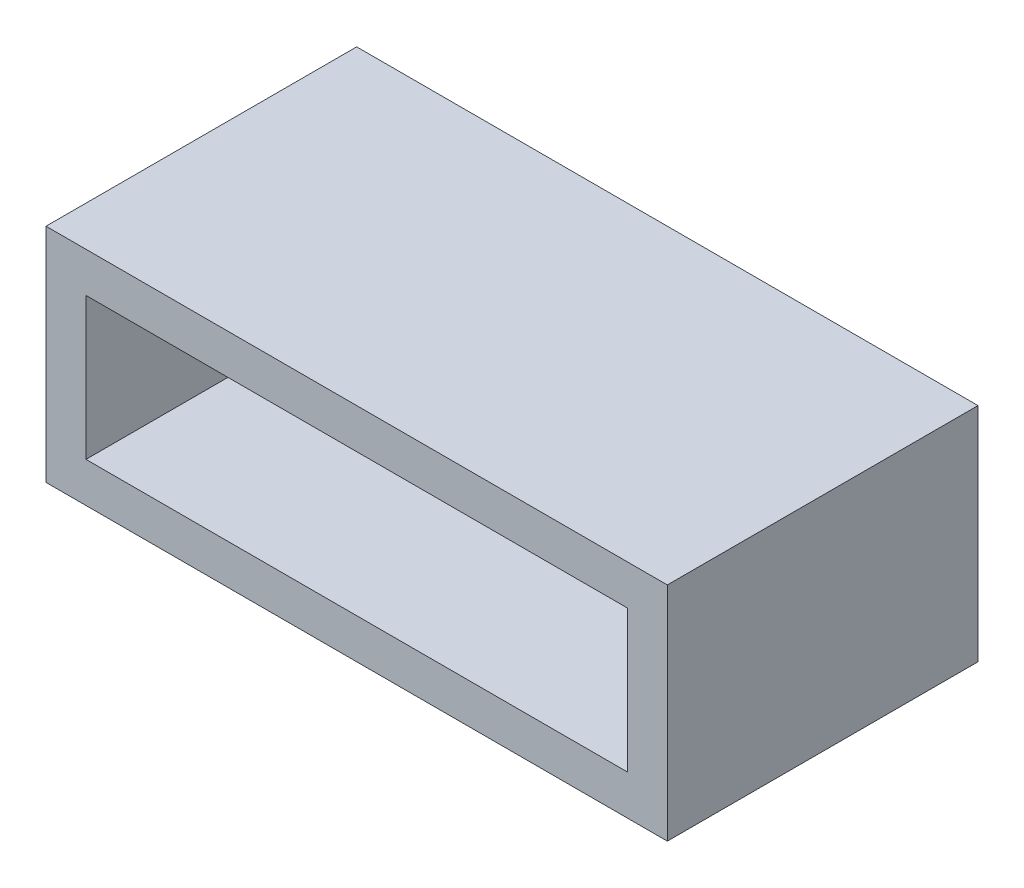
ISO-10303-21;
HEADER;
FILE_DESCRIPTION(('STEP AP214'),'2;1');
FILE_NAME('part.step','',(''),(''),'','','');
FILE_SCHEMA(('AUTOMOTIVE_DESIGN { 1 0 10303 214 1 1 1 1 }'));
ENDSEC;
DATA;
#1=APPLICATION_CONTEXT('core data for automotive mechanical design processes');
#2=APPLICATION_PROTOCOL_DEFINITION('international standard','automotive_design',2000,#1);
#3=PRODUCT_CONTEXT('',#1,'mechanical');
#4=PRODUCT('Part','Part','',(#3));
#5=PRODUCT_RELATED_PRODUCT_CATEGORY('part','',(#4));
#6=PRODUCT_DEFINITION_FORMATION('','',#4);
#7=PRODUCT_DEFINITION_CONTEXT('part definition',#1,'design');
#8=PRODUCT_DEFINITION('design','',#6,#7);
#9=PRODUCT_DEFINITION_SHAPE('','',#8);
#10=(LENGTH_UNIT() NAMED_UNIT(*) SI_UNIT(.MILLI.,.METRE.));
#11=(NAMED_UNIT(*) PLANE_ANGLE_UNIT() SI_UNIT($,.RADIAN.));
#12=(NAMED_UNIT(*) SI_UNIT($,.STERADIAN.) SOLID_ANGLE_UNIT());
#13=UNCERTAINTY_MEASURE_WITH_UNIT(LENGTH_MEASURE(1.E-05),#10,'distance_accuracy_value','');
#14=(GEOMETRIC_REPRESENTATION_CONTEXT(3) GLOBAL_UNCERTAINTY_ASSIGNED_CONTEXT((#13)) GLOBAL_UNIT_ASSIGNED_CONTEXT((#10,
#11,#12)) REPRESENTATION_CONTEXT('',''));
#15=CARTESIAN_POINT('',(0.,0.,0.));
#16=DIRECTION('',(0.,0.,1.));
#17=DIRECTION('',(1.,0.,0.));
#18=AXIS2_PLACEMENT_3D('',#15,#16,#17);
#19=CARTESIAN_POINT('',(0.,0.,6.));
#20=DIRECTION('',(0.,0.,-1.));
#21=DIRECTION('',(-1.,0.,0.));
#22=AXIS2_PLACEMENT_3D('',#19,#20,#21);
#23=PLANE('',#22);
#24=DIRECTION('',(0.,-1.,0.));
#25=VECTOR('',#24,1.);
#26=CARTESIAN_POINT('',(14.,-20.,6.));
#27=LINE('',#26,#25);
#28=CARTESIAN_POINT('',(14.,-15.,6.));
#29=VERTEX_POINT('',#28);
#30=CARTESIAN_POINT('',(14.,-20.,6.));
#31=VERTEX_POINT('',#30);
#32=EDGE_CURVE('E154',#29,#31,#27,.T.);
#33=ORIENTED_EDGE('',*,*,#32,.T.);
#34=DIRECTION('',(1.,0.,0.));
#35=VECTOR('',#34,1.);
#36=CARTESIAN_POINT('',(14.,-20.,6.));
#37=LINE('',#36,#35);
#38=CARTESIAN_POINT('',(28.,-20.,6.));
#39=VERTEX_POINT('',#38);
#40=EDGE_CURVE('E98',#31,#39,#37,.T.);
#41=ORIENTED_EDGE('',*,*,#40,.T.);
#42=DIRECTION('',(0.,1.,0.));
#43=VECTOR('',#42,1.);
#44=CARTESIAN_POINT('',(28.,-20.,6.));
#45=LINE('',#44,#43);
#46=CARTESIAN_POINT('',(28.,-15.,6.));
#47=VERTEX_POINT('',#46);
#48=EDGE_CURVE('E158',#39,#47,#45,.T.);
#49=ORIENTED_EDGE('',*,*,#48,.T.);
#50=DIRECTION('',(-1.,0.,0.));
#51=VECTOR('',#50,1.);
#52=CARTESIAN_POINT('',(14.,-15.,6.));
#53=LINE('',#52,#51);
#54=EDGE_CURVE('E68',#47,#29,#53,.T.);
#55=ORIENTED_EDGE('',*,*,#54,.T.);
#56=EDGE_LOOP('',(#33,#41,#49,#55));
#57=FACE_BOUND('',#56,.T.);
#58=DIRECTION('',(0.,-1.,0.));
#59=VECTOR('',#58,1.);
#60=CARTESIAN_POINT('',(14.9,0.,6.));
#61=LINE('',#60,#59);
#62=CARTESIAN_POINT('',(14.9,-15.9,6.));
#63=VERTEX_POINT('',#62);
#64=CARTESIAN_POINT('',(14.9,-19.1,6.));
#65=VERTEX_POINT('',#64);
#66=EDGE_CURVE('E11',#63,#65,#61,.T.);
#67=ORIENTED_EDGE('',*,*,#66,.F.);
#68=DIRECTION('',(-1.,0.,0.));
#69=VECTOR('',#68,1.);
#70=CARTESIAN_POINT('',(0.,-15.9,6.));
#71=LINE('',#70,#69);
#72=CARTESIAN_POINT('',(27.1,-15.9,6.));
#73=VERTEX_POINT('',#72);
#74=EDGE_CURVE('E176',#73,#63,#71,.T.);
#75=ORIENTED_EDGE('',*,*,#74,.F.);
#76=DIRECTION('',(0.,1.,0.));
#77=VECTOR('',#76,1.);
#78=CARTESIAN_POINT('',(27.1,0.,6.));
#79=LINE('',#78,#77);
#80=CARTESIAN_POINT('',(27.1,-19.1,6.));
#81=VERTEX_POINT('',#80);
#82=EDGE_CURVE('E178',#81,#73,#79,.T.);
#83=ORIENTED_EDGE('',*,*,#82,.F.);
#84=DIRECTION('',(1.,0.,0.));
#85=VECTOR('',#84,1.);
#86=CARTESIAN_POINT('',(0.,-19.1,6.));
#87=LINE('',#86,#85);
#88=EDGE_CURVE('E55',#65,#81,#87,.T.);
#89=ORIENTED_EDGE('',*,*,#88,.F.);
#90=EDGE_LOOP('',(#67,#75,#83,#89));
#91=FACE_BOUND('',#90,.T.);
#92=ADVANCED_FACE('F43',(#57,#91),#23,.F.);
#93=CARTESIAN_POINT('',(14.,-20.,6.));
#94=DIRECTION('',(1.,0.,0.));
#95=DIRECTION('',(0.,0.,-1.));
#96=AXIS2_PLACEMENT_3D('',#93,#94,#95);
#97=PLANE('',#96);
#98=DIRECTION('',(0.,-1.,0.));
#99=VECTOR('',#98,1.);
#100=CARTESIAN_POINT('',(14.,-20.,-1.));
#101=LINE('',#100,#99);
#102=CARTESIAN_POINT('',(14.,-15.,-1.));
#103=VERTEX_POINT('',#102);
#104=CARTESIAN_POINT('',(14.,-20.,-1.));
#105=VERTEX_POINT('',#104);
#106=EDGE_CURVE('E126',#103,#105,#101,.T.);
#107=ORIENTED_EDGE('',*,*,#106,.T.);
#108=DIRECTION('',(0.,0.,-1.));
#109=VECTOR('',#108,1.);
#110=CARTESIAN_POINT('',(14.,-20.,6.));
#111=LINE('',#110,#109);
#112=EDGE_CURVE('E173',#31,#105,#111,.T.);
#113=ORIENTED_EDGE('',*,*,#112,.F.);
#114=ORIENTED_EDGE('',*,*,#32,.F.);
#115=DIRECTION('',(0.,0.,-1.));
#116=VECTOR('',#115,1.);
#117=CARTESIAN_POINT('',(14.,-15.,6.));
#118=LINE('',#117,#116);
#119=EDGE_CURVE('E161',#29,#103,#118,.T.);
#120=ORIENTED_EDGE('',*,*,#119,.T.);
#121=EDGE_LOOP('',(#107,#113,#114,#120));
#122=FACE_BOUND('',#121,.T.);
#123=ADVANCED_FACE('F44',(#122),#97,.F.);
#124=CARTESIAN_POINT('',(14.,-20.,6.));
#125=DIRECTION('',(0.,1.,0.));
#126=DIRECTION('',(0.,0.,1.));
#127=AXIS2_PLACEMENT_3D('',#124,#125,#126);
#128=PLANE('',#127);
#129=DIRECTION('',(1.,0.,0.));
#130=VECTOR('',#129,1.);
#131=CARTESIAN_POINT('',(14.,-20.,-1.));
#132=LINE('',#131,#130);
#133=CARTESIAN_POINT('',(28.,-20.,-1.));
#134=VERTEX_POINT('',#133);
#135=EDGE_CURVE('E163',#105,#134,#132,.T.);
#136=ORIENTED_EDGE('',*,*,#135,.T.);
#137=DIRECTION('',(0.,0.,-1.));
#138=VECTOR('',#137,1.);
#139=CARTESIAN_POINT('',(28.,-20.,6.));
#140=LINE('',#139,#138);
#141=EDGE_CURVE('E175',#39,#134,#140,.T.);
#142=ORIENTED_EDGE('',*,*,#141,.F.);
#143=ORIENTED_EDGE('',*,*,#40,.F.);
#144=ORIENTED_EDGE('',*,*,#112,.T.);
#145=EDGE_LOOP('',(#136,#142,#143,#144));
#146=FACE_BOUND('',#145,.T.);
#147=ADVANCED_FACE('F214',(#146),#128,.F.);
#148=CARTESIAN_POINT('',(28.,-20.,6.));
#149=DIRECTION('',(-1.,0.,0.));
#150=DIRECTION('',(0.,0.,1.));
#151=AXIS2_PLACEMENT_3D('',#148,#149,#150);
#152=PLANE('',#151);
#153=DIRECTION('',(0.,1.,0.));
#154=VECTOR('',#153,1.);
#155=CARTESIAN_POINT('',(28.,-20.,-1.));
#156=LINE('',#155,#154);
#157=CARTESIAN_POINT('',(28.,-15.,-1.));
#158=VERTEX_POINT('',#157);
#159=EDGE_CURVE('E167',#134,#158,#156,.T.);
#160=ORIENTED_EDGE('',*,*,#159,.T.);
#161=DIRECTION('',(0.,0.,-1.));
#162=VECTOR('',#161,1.);
#163=CARTESIAN_POINT('',(28.,-15.,6.));
#164=LINE('',#163,#162);
#165=EDGE_CURVE('E168',#47,#158,#164,.T.);
#166=ORIENTED_EDGE('',*,*,#165,.F.);
#167=ORIENTED_EDGE('',*,*,#48,.F.);
#168=ORIENTED_EDGE('',*,*,#141,.T.);
#169=EDGE_LOOP('',(#160,#166,#167,#168));
#170=FACE_BOUND('',#169,.T.);
#171=ADVANCED_FACE('F227',(#170),#152,.F.);
#172=CARTESIAN_POINT('',(14.,-15.,6.));
#173=DIRECTION('',(0.,-1.,0.));
#174=DIRECTION('',(0.,0.,-1.));
#175=AXIS2_PLACEMENT_3D('',#172,#173,#174);
#176=PLANE('',#175);
#177=DIRECTION('',(-1.,0.,0.));
#178=VECTOR('',#177,1.);
#179=CARTESIAN_POINT('',(14.,-15.,-1.));
#180=LINE('',#179,#178);
#181=EDGE_CURVE('E89',#158,#103,#180,.T.);
#182=ORIENTED_EDGE('',*,*,#181,.T.);
#183=ORIENTED_EDGE('',*,*,#119,.F.);
#184=ORIENTED_EDGE('',*,*,#54,.F.);
#185=ORIENTED_EDGE('',*,*,#165,.T.);
#186=EDGE_LOOP('',(#182,#183,#184,#185));
#187=FACE_BOUND('',#186,.T.);
#188=ADVANCED_FACE('F224',(#187),#176,.F.);
#189=CARTESIAN_POINT('',(0.,0.,-1.));
#190=DIRECTION('',(0.,0.,-1.));
#191=DIRECTION('',(-1.,0.,0.));
#192=AXIS2_PLACEMENT_3D('',#189,#190,#191);
#193=PLANE('',#192);
#194=CARTESIAN_POINT('',(18.,-17.5,-1.));
#195=DIRECTION('',(0.,0.,-1.));
#196=DIRECTION('',(-1.,0.,0.));
#197=AXIS2_PLACEMENT_3D('',#194,#195,#196);
#198=CIRCLE('',#197,1.1);
#199=CARTESIAN_POINT('',(16.9,-17.5,-1.));
#200=VERTEX_POINT('',#199);
#201=EDGE_CURVE('E141',#200,#200,#198,.F.);
#202=ORIENTED_EDGE('',*,*,#201,.T.);
#203=EDGE_LOOP('',(#202));
#204=FACE_BOUND('',#203,.T.);
#205=CARTESIAN_POINT('',(24.,-17.5,-1.));
#206=DIRECTION('',(0.,0.,-1.));
#207=DIRECTION('',(-1.,0.,0.));
#208=AXIS2_PLACEMENT_3D('',#205,#206,#207);
#209=CIRCLE('',#208,1.1);
#210=CARTESIAN_POINT('',(22.9,-17.5,-1.));
#211=VERTEX_POINT('',#210);
#212=EDGE_CURVE('E181',#211,#211,#209,.F.);
#213=ORIENTED_EDGE('',*,*,#212,.T.);
#214=EDGE_LOOP('',(#213));
#215=FACE_BOUND('',#214,.T.);
#216=ORIENTED_EDGE('',*,*,#106,.F.);
#217=ORIENTED_EDGE('',*,*,#181,.F.);
#218=ORIENTED_EDGE('',*,*,#159,.F.);
#219=ORIENTED_EDGE('',*,*,#135,.F.);
#220=EDGE_LOOP('',(#216,#217,#218,#219));
#221=FACE_BOUND('',#220,.T.);
#222=ADVANCED_FACE('F222',(#204,#215,#221),#193,.T.);
#223=CARTESIAN_POINT('',(14.9,-19.1,7.));
#224=DIRECTION('',(1.,0.,0.));
#225=DIRECTION('',(0.,0.,-1.));
#226=AXIS2_PLACEMENT_3D('',#223,#224,#225);
#227=PLANE('',#226);
#228=ORIENTED_EDGE('',*,*,#66,.T.);
#229=DIRECTION('',(0.,0.,-1.));
#230=VECTOR('',#229,1.);
#231=CARTESIAN_POINT('',(14.9,-19.1,7.));
#232=LINE('',#231,#230);
#233=CARTESIAN_POINT('',(14.9,-19.1,0.));
#234=VERTEX_POINT('',#233);
#235=EDGE_CURVE('E116',#65,#234,#232,.T.);
#236=ORIENTED_EDGE('',*,*,#235,.T.);
#237=DIRECTION('',(0.,-1.,0.));
#238=VECTOR('',#237,1.);
#239=CARTESIAN_POINT('',(14.9,-19.1,0.));
#240=LINE('',#239,#238);
#241=CARTESIAN_POINT('',(14.9,-15.9,0.));
#242=VERTEX_POINT('',#241);
#243=EDGE_CURVE('E123',#242,#234,#240,.T.);
#244=ORIENTED_EDGE('',*,*,#243,.F.);
#245=DIRECTION('',(0.,0.,-1.));
#246=VECTOR('',#245,1.);
#247=CARTESIAN_POINT('',(14.9,-15.9,7.));
#248=LINE('',#247,#246);
#249=EDGE_CURVE('E151',#63,#242,#248,.T.);
#250=ORIENTED_EDGE('',*,*,#249,.F.);
#251=EDGE_LOOP('',(#228,#236,#244,#250));
#252=FACE_BOUND('',#251,.T.);
#253=ADVANCED_FACE('F124',(#252),#227,.T.);
#254=CARTESIAN_POINT('',(14.9,-19.1,7.));
#255=DIRECTION('',(0.,1.,0.));
#256=DIRECTION('',(0.,0.,1.));
#257=AXIS2_PLACEMENT_3D('',#254,#255,#256);
#258=PLANE('',#257);
#259=ORIENTED_EDGE('',*,*,#88,.T.);
#260=DIRECTION('',(0.,0.,-1.));
#261=VECTOR('',#260,1.);
#262=CARTESIAN_POINT('',(27.1,-19.1,7.));
#263=LINE('',#262,#261);
#264=CARTESIAN_POINT('',(27.1,-19.1,0.));
#265=VERTEX_POINT('',#264);
#266=EDGE_CURVE('E129',#81,#265,#263,.T.);
#267=ORIENTED_EDGE('',*,*,#266,.T.);
#268=DIRECTION('',(1.,0.,0.));
#269=VECTOR('',#268,1.);
#270=CARTESIAN_POINT('',(14.9,-19.1,0.));
#271=LINE('',#270,#269);
#272=EDGE_CURVE('E135',#234,#265,#271,.T.);
#273=ORIENTED_EDGE('',*,*,#272,.F.);
#274=ORIENTED_EDGE('',*,*,#235,.F.);
#275=EDGE_LOOP('',(#259,#267,#273,#274));
#276=FACE_BOUND('',#275,.T.);
#277=ADVANCED_FACE('F134',(#276),#258,.T.);
#278=CARTESIAN_POINT('',(27.1,-19.1,7.));
#279=DIRECTION('',(-1.,0.,0.));
#280=DIRECTION('',(0.,0.,1.));
#281=AXIS2_PLACEMENT_3D('',#278,#279,#280);
#282=PLANE('',#281);
#283=ORIENTED_EDGE('',*,*,#82,.T.);
#284=DIRECTION('',(0.,0.,-1.));
#285=VECTOR('',#284,1.);
#286=CARTESIAN_POINT('',(27.1,-15.9,7.));
#287=LINE('',#286,#285);
#288=CARTESIAN_POINT('',(27.1,-15.9,0.));
#289=VERTEX_POINT('',#288);
#290=EDGE_CURVE('E58',#73,#289,#287,.T.);
#291=ORIENTED_EDGE('',*,*,#290,.T.);
#292=DIRECTION('',(0.,1.,0.));
#293=VECTOR('',#292,1.);
#294=CARTESIAN_POINT('',(27.1,-19.1,0.));
#295=LINE('',#294,#293);
#296=EDGE_CURVE('E140',#265,#289,#295,.T.);
#297=ORIENTED_EDGE('',*,*,#296,.F.);
#298=ORIENTED_EDGE('',*,*,#266,.F.);
#299=EDGE_LOOP('',(#283,#291,#297,#298));
#300=FACE_BOUND('',#299,.T.);
#301=ADVANCED_FACE('F206',(#300),#282,.T.);
#302=CARTESIAN_POINT('',(14.9,-15.9,7.));
#303=DIRECTION('',(0.,-1.,0.));
#304=DIRECTION('',(0.,0.,-1.));
#305=AXIS2_PLACEMENT_3D('',#302,#303,#304);
#306=PLANE('',#305);
#307=ORIENTED_EDGE('',*,*,#74,.T.);
#308=ORIENTED_EDGE('',*,*,#249,.T.);
#309=DIRECTION('',(-1.,0.,0.));
#310=VECTOR('',#309,1.);
#311=CARTESIAN_POINT('',(14.9,-15.9,0.));
#312=LINE('',#311,#310);
#313=EDGE_CURVE('E142',#289,#242,#312,.T.);
#314=ORIENTED_EDGE('',*,*,#313,.F.);
#315=ORIENTED_EDGE('',*,*,#290,.F.);
#316=EDGE_LOOP('',(#307,#308,#314,#315));
#317=FACE_BOUND('',#316,.T.);
#318=ADVANCED_FACE('F197',(#317),#306,.T.);
#319=CARTESIAN_POINT('',(0.,0.,0.));
#320=DIRECTION('',(0.,0.,-1.));
#321=DIRECTION('',(-1.,0.,0.));
#322=AXIS2_PLACEMENT_3D('',#319,#320,#321);
#323=PLANE('',#322);
#324=CARTESIAN_POINT('',(18.,-17.5,0.));
#325=DIRECTION('',(0.,0.,-1.));
#326=DIRECTION('',(-1.,0.,0.));
#327=AXIS2_PLACEMENT_3D('',#324,#325,#326);
#328=CIRCLE('',#327,1.1);
#329=CARTESIAN_POINT('',(16.9,-17.5,0.));
#330=VERTEX_POINT('',#329);
#331=EDGE_CURVE('E50',#330,#330,#328,.F.);
#332=ORIENTED_EDGE('',*,*,#331,.F.);
#333=EDGE_LOOP('',(#332));
#334=FACE_BOUND('',#333,.T.);
#335=CARTESIAN_POINT('',(24.,-17.5,0.));
#336=DIRECTION('',(0.,0.,-1.));
#337=DIRECTION('',(-1.,0.,0.));
#338=AXIS2_PLACEMENT_3D('',#335,#336,#337);
#339=CIRCLE('',#338,1.1);
#340=CARTESIAN_POINT('',(22.9,-17.5,0.));
#341=VERTEX_POINT('',#340);
#342=EDGE_CURVE('E182',#341,#341,#339,.F.);
#343=ORIENTED_EDGE('',*,*,#342,.F.);
#344=EDGE_LOOP('',(#343));
#345=FACE_BOUND('',#344,.T.);
#346=ORIENTED_EDGE('',*,*,#243,.T.);
#347=ORIENTED_EDGE('',*,*,#272,.T.);
#348=ORIENTED_EDGE('',*,*,#296,.T.);
#349=ORIENTED_EDGE('',*,*,#313,.T.);
#350=EDGE_LOOP('',(#346,#347,#348,#349));
#351=FACE_BOUND('',#350,.T.);
#352=ADVANCED_FACE('F143',(#334,#345,#351),#323,.F.);
#353=CARTESIAN_POINT('',(24.,-17.5,6.));
#354=DIRECTION('',(0.,0.,-1.));
#355=DIRECTION('',(-1.,0.,0.));
#356=AXIS2_PLACEMENT_3D('',#353,#354,#355);
#357=CYLINDRICAL_SURFACE('',#356,1.1);
#358=ORIENTED_EDGE('',*,*,#212,.F.);
#359=EDGE_LOOP('',(#358));
#360=FACE_BOUND('',#359,.T.);
#361=ORIENTED_EDGE('',*,*,#342,.T.);
#362=EDGE_LOOP('',(#361));
#363=FACE_BOUND('',#362,.T.);
#364=ADVANCED_FACE('F198',(#360,#363),#357,.F.);
#365=CARTESIAN_POINT('',(18.,-17.5,6.));
#366=DIRECTION('',(0.,0.,-1.));
#367=DIRECTION('',(-1.,0.,0.));
#368=AXIS2_PLACEMENT_3D('',#365,#366,#367);
#369=CYLINDRICAL_SURFACE('',#368,1.1);
#370=ORIENTED_EDGE('',*,*,#201,.F.);
#371=EDGE_LOOP('',(#370));
#372=FACE_BOUND('',#371,.T.);
#373=ORIENTED_EDGE('',*,*,#331,.T.);
#374=EDGE_LOOP('',(#373));
#375=FACE_BOUND('',#374,.T.);
#376=ADVANCED_FACE('F191',(#372,#375),#369,.F.);
#377=CLOSED_SHELL('',(#92,#123,#147,#171,#188,#222,#253,#277,#301,#318,#352,#364,#376));
#378=MANIFOLD_SOLID_BREP('B2',#377);
#379=ADVANCED_BREP_SHAPE_REPRESENTATION('',(#18,#378),#14);
#380=SHAPE_DEFINITION_REPRESENTATION(#9,#379);
ENDSEC;
END-ISO-10303-21;
